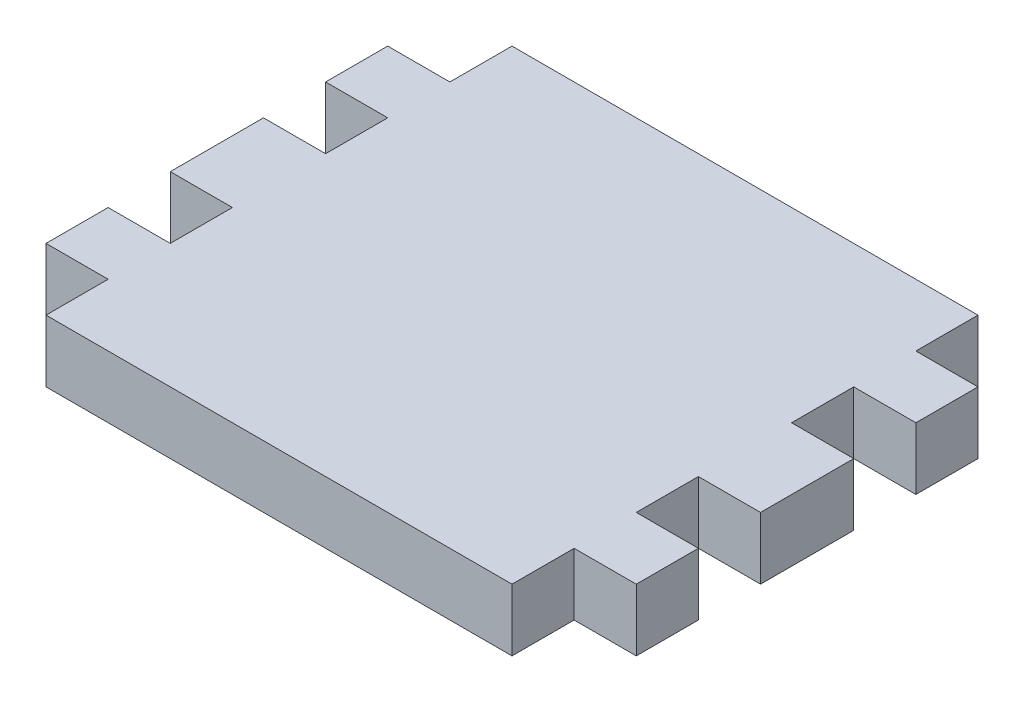
ISO-10303-21;
HEADER;
FILE_DESCRIPTION(('STEP AP214'),'2;1');
FILE_NAME('part.step','',(''),(''),'','','');
FILE_SCHEMA(('AUTOMOTIVE_DESIGN { 1 0 10303 214 1 1 1 1 }'));
ENDSEC;
DATA;
#1=APPLICATION_CONTEXT('core data for automotive mechanical design processes');
#2=APPLICATION_PROTOCOL_DEFINITION('international standard','automotive_design',2000,#1);
#3=PRODUCT_CONTEXT('',#1,'mechanical');
#4=PRODUCT('Part','Part','',(#3));
#5=PRODUCT_RELATED_PRODUCT_CATEGORY('part','',(#4));
#6=PRODUCT_DEFINITION_FORMATION('','',#4);
#7=PRODUCT_DEFINITION_CONTEXT('part definition',#1,'design');
#8=PRODUCT_DEFINITION('design','',#6,#7);
#9=PRODUCT_DEFINITION_SHAPE('','',#8);
#10=(LENGTH_UNIT() NAMED_UNIT(*) SI_UNIT(.MILLI.,.METRE.));
#11=(NAMED_UNIT(*) PLANE_ANGLE_UNIT() SI_UNIT($,.RADIAN.));
#12=(NAMED_UNIT(*) SI_UNIT($,.STERADIAN.) SOLID_ANGLE_UNIT());
#13=UNCERTAINTY_MEASURE_WITH_UNIT(LENGTH_MEASURE(1.E-05),#10,'distance_accuracy_value','');
#14=(GEOMETRIC_REPRESENTATION_CONTEXT(3) GLOBAL_UNCERTAINTY_ASSIGNED_CONTEXT((#13)) GLOBAL_UNIT_ASSIGNED_CONTEXT((#10,
#11,#12)) REPRESENTATION_CONTEXT('',''));
#15=CARTESIAN_POINT('',(0.,0.,0.));
#16=DIRECTION('',(0.,0.,1.));
#17=DIRECTION('',(1.,0.,0.));
#18=AXIS2_PLACEMENT_3D('',#15,#16,#17);
#19=CARTESIAN_POINT('',(-17.8025777777778,5.08,-11.0461777777778));
#20=DIRECTION('',(1.,0.,0.));
#21=DIRECTION('',(0.,0.,-1.));
#22=AXIS2_PLACEMENT_3D('',#19,#20,#21);
#23=PLANE('',#22);
#24=DIRECTION('',(0.,0.,1.));
#25=VECTOR('',#24,1.);
#26=CARTESIAN_POINT('',(-17.8025777777778,0.,-11.0461777777778));
#27=LINE('',#26,#25);
#28=CARTESIAN_POINT('',(-17.8025777777778,0.,4.19382222222222));
#29=VERTEX_POINT('',#28);
#30=CARTESIAN_POINT('',(-17.8025777777778,0.,11.8138222222222));
#31=VERTEX_POINT('',#30);
#32=EDGE_CURVE('E247',#29,#31,#27,.T.);
#33=ORIENTED_EDGE('',*,*,#32,.T.);
#34=DIRECTION('',(0.,1.,0.));
#35=VECTOR('',#34,1.);
#36=CARTESIAN_POINT('',(-17.8025777777778,0.,11.8138222222222));
#37=LINE('',#36,#35);
#38=CARTESIAN_POINT('',(-17.8025777777778,5.08,11.8138222222222));
#39=VERTEX_POINT('',#38);
#40=EDGE_CURVE('E404',#31,#39,#37,.T.);
#41=ORIENTED_EDGE('',*,*,#40,.T.);
#42=DIRECTION('',(0.,0.,1.));
#43=VECTOR('',#42,1.);
#44=CARTESIAN_POINT('',(-17.8025777777778,5.08,-11.0461777777778));
#45=LINE('',#44,#43);
#46=CARTESIAN_POINT('',(-17.8025777777778,5.08,4.19382222222222));
#47=VERTEX_POINT('',#46);
#48=EDGE_CURVE('E285',#47,#39,#45,.T.);
#49=ORIENTED_EDGE('',*,*,#48,.F.);
#50=DIRECTION('',(0.,1.,0.));
#51=VECTOR('',#50,1.);
#52=CARTESIAN_POINT('',(-17.8025777777778,0.,4.19382222222222));
#53=LINE('',#52,#51);
#54=EDGE_CURVE('E399',#29,#47,#53,.T.);
#55=ORIENTED_EDGE('',*,*,#54,.F.);
#56=EDGE_LOOP('',(#33,#41,#49,#55));
#57=FACE_BOUND('',#56,.T.);
#58=ADVANCED_FACE('F33',(#57),#23,.F.);
#59=CARTESIAN_POINT('',(-17.8025777777778,0.,-5.96617777777778));
#60=VERTEX_POINT('',#59);
#61=CARTESIAN_POINT('',(-17.8025777777778,0.,-0.886177777777776));
#62=VERTEX_POINT('',#61);
#63=EDGE_CURVE('E250',#60,#62,#27,.T.);
#64=ORIENTED_EDGE('',*,*,#63,.T.);
#65=DIRECTION('',(0.,1.,0.));
#66=VECTOR('',#65,1.);
#67=CARTESIAN_POINT('',(-17.8025777777778,0.,-0.886177777777776));
#68=LINE('',#67,#66);
#69=CARTESIAN_POINT('',(-17.8025777777778,5.08,-0.886177777777776));
#70=VERTEX_POINT('',#69);
#71=EDGE_CURVE('E381',#62,#70,#68,.T.);
#72=ORIENTED_EDGE('',*,*,#71,.T.);
#73=CARTESIAN_POINT('',(-17.8025777777778,5.08,-5.96617777777778));
#74=VERTEX_POINT('',#73);
#75=EDGE_CURVE('E287',#74,#70,#45,.T.);
#76=ORIENTED_EDGE('',*,*,#75,.F.);
#77=DIRECTION('',(0.,1.,0.));
#78=VECTOR('',#77,1.);
#79=CARTESIAN_POINT('',(-17.8025777777778,0.,-5.96617777777778));
#80=LINE('',#79,#78);
#81=EDGE_CURVE('E252',#60,#74,#80,.T.);
#82=ORIENTED_EDGE('',*,*,#81,.F.);
#83=EDGE_LOOP('',(#64,#72,#76,#82));
#84=FACE_BOUND('',#83,.T.);
#85=ADVANCED_FACE('F448',(#84),#23,.F.);
#86=CARTESIAN_POINT('',(30.4574222222222,5.08,-11.0461777777778));
#87=DIRECTION('',(-1.,0.,0.));
#88=DIRECTION('',(0.,0.,1.));
#89=AXIS2_PLACEMENT_3D('',#86,#87,#88);
#90=PLANE('',#89);
#91=DIRECTION('',(0.,0.,-1.));
#92=VECTOR('',#91,1.);
#93=CARTESIAN_POINT('',(30.4574222222222,0.,-11.0461777777778));
#94=LINE('',#93,#92);
#95=CARTESIAN_POINT('',(30.4574222222222,0.,-0.886177777777769));
#96=VERTEX_POINT('',#95);
#97=CARTESIAN_POINT('',(30.4574222222222,0.,-5.96617777777777));
#98=VERTEX_POINT('',#97);
#99=EDGE_CURVE('E262',#96,#98,#94,.T.);
#100=ORIENTED_EDGE('',*,*,#99,.T.);
#101=DIRECTION('',(0.,1.,0.));
#102=VECTOR('',#101,1.);
#103=CARTESIAN_POINT('',(30.4574222222222,0.,-5.96617777777777));
#104=LINE('',#103,#102);
#105=CARTESIAN_POINT('',(30.4574222222222,5.08,-5.96617777777777));
#106=VERTEX_POINT('',#105);
#107=EDGE_CURVE('E348',#98,#106,#104,.T.);
#108=ORIENTED_EDGE('',*,*,#107,.T.);
#109=DIRECTION('',(0.,0.,-1.));
#110=VECTOR('',#109,1.);
#111=CARTESIAN_POINT('',(30.4574222222222,5.08,-11.0461777777778));
#112=LINE('',#111,#110);
#113=CARTESIAN_POINT('',(30.4574222222222,5.08,-0.886177777777769));
#114=VERTEX_POINT('',#113);
#115=EDGE_CURVE('E299',#114,#106,#112,.T.);
#116=ORIENTED_EDGE('',*,*,#115,.F.);
#117=DIRECTION('',(0.,1.,0.));
#118=VECTOR('',#117,1.);
#119=CARTESIAN_POINT('',(30.4574222222222,0.,-0.886177777777769));
#120=LINE('',#119,#118);
#121=EDGE_CURVE('E352',#96,#114,#120,.T.);
#122=ORIENTED_EDGE('',*,*,#121,.F.);
#123=EDGE_LOOP('',(#100,#108,#116,#122));
#124=FACE_BOUND('',#123,.T.);
#125=ADVANCED_FACE('F506',(#124),#90,.F.);
#126=CARTESIAN_POINT('',(30.4574222222222,0.,21.9738222222222));
#127=VERTEX_POINT('',#126);
#128=CARTESIAN_POINT('',(30.4574222222222,0.,16.8938222222222));
#129=VERTEX_POINT('',#128);
#130=EDGE_CURVE('E269',#127,#129,#94,.T.);
#131=ORIENTED_EDGE('',*,*,#130,.T.);
#132=DIRECTION('',(0.,1.,0.));
#133=VECTOR('',#132,1.);
#134=CARTESIAN_POINT('',(30.4574222222222,0.,16.8938222222222));
#135=LINE('',#134,#133);
#136=CARTESIAN_POINT('',(30.4574222222222,5.08,16.8938222222222));
#137=VERTEX_POINT('',#136);
#138=EDGE_CURVE('E321',#129,#137,#135,.T.);
#139=ORIENTED_EDGE('',*,*,#138,.T.);
#140=CARTESIAN_POINT('',(30.4574222222222,5.08,21.9738222222222));
#141=VERTEX_POINT('',#140);
#142=EDGE_CURVE('E42',#141,#137,#112,.T.);
#143=ORIENTED_EDGE('',*,*,#142,.F.);
#144=DIRECTION('',(0.,1.,0.));
#145=VECTOR('',#144,1.);
#146=CARTESIAN_POINT('',(30.4574222222222,0.,21.9738222222222));
#147=LINE('',#146,#145);
#148=EDGE_CURVE('E320',#127,#141,#147,.T.);
#149=ORIENTED_EDGE('',*,*,#148,.F.);
#150=EDGE_LOOP('',(#131,#139,#143,#149));
#151=FACE_BOUND('',#150,.T.);
#152=ADVANCED_FACE('F319',(#151),#90,.F.);
#153=CARTESIAN_POINT('',(-17.8025777777778,5.08,16.8938222222222));
#154=VERTEX_POINT('',#153);
#155=CARTESIAN_POINT('',(-17.8025777777778,5.08,21.9738222222222));
#156=VERTEX_POINT('',#155);
#157=EDGE_CURVE('E238',#154,#156,#45,.T.);
#158=ORIENTED_EDGE('',*,*,#157,.F.);
#159=DIRECTION('',(0.,1.,0.));
#160=VECTOR('',#159,1.);
#161=CARTESIAN_POINT('',(-17.8025777777778,0.,16.8938222222222));
#162=LINE('',#161,#160);
#163=CARTESIAN_POINT('',(-17.8025777777778,0.,16.8938222222222));
#164=VERTEX_POINT('',#163);
#165=EDGE_CURVE('E223',#164,#154,#162,.T.);
#166=ORIENTED_EDGE('',*,*,#165,.F.);
#167=CARTESIAN_POINT('',(-17.8025777777778,0.,21.9738222222222));
#168=VERTEX_POINT('',#167);
#169=EDGE_CURVE('E236',#164,#168,#27,.T.);
#170=ORIENTED_EDGE('',*,*,#169,.T.);
#171=DIRECTION('',(0.,1.,0.));
#172=VECTOR('',#171,1.);
#173=CARTESIAN_POINT('',(-17.8025777777778,0.,21.9738222222222));
#174=LINE('',#173,#172);
#175=EDGE_CURVE('E425',#168,#156,#174,.T.);
#176=ORIENTED_EDGE('',*,*,#175,.T.);
#177=EDGE_LOOP('',(#158,#166,#170,#176));
#178=FACE_BOUND('',#177,.T.);
#179=ADVANCED_FACE('F35',(#178),#23,.F.);
#180=CARTESIAN_POINT('',(-17.8025777777778,5.08,27.0538222222222));
#181=DIRECTION('',(0.,0.,-1.));
#182=DIRECTION('',(-1.,0.,0.));
#183=AXIS2_PLACEMENT_3D('',#180,#181,#182);
#184=PLANE('',#183);
#185=DIRECTION('',(1.,0.,0.));
#186=VECTOR('',#185,1.);
#187=CARTESIAN_POINT('',(-17.8025777777778,5.08,27.0538222222222));
#188=LINE('',#187,#186);
#189=CARTESIAN_POINT('',(-12.7225777777778,5.08,27.0538222222222));
#190=VERTEX_POINT('',#189);
#191=CARTESIAN_POINT('',(25.3774222222222,5.08,27.0538222222222));
#192=VERTEX_POINT('',#191);
#193=EDGE_CURVE('E294',#190,#192,#188,.T.);
#194=ORIENTED_EDGE('',*,*,#193,.F.);
#195=DIRECTION('',(0.,1.,0.));
#196=VECTOR('',#195,1.);
#197=CARTESIAN_POINT('',(-12.7225777777778,0.,27.0538222222222));
#198=LINE('',#197,#196);
#199=CARTESIAN_POINT('',(-12.7225777777778,0.,27.0538222222222));
#200=VERTEX_POINT('',#199);
#201=EDGE_CURVE('E422',#200,#190,#198,.T.);
#202=ORIENTED_EDGE('',*,*,#201,.F.);
#203=DIRECTION('',(1.,0.,0.));
#204=VECTOR('',#203,1.);
#205=CARTESIAN_POINT('',(-17.8025777777778,0.,27.0538222222222));
#206=LINE('',#205,#204);
#207=CARTESIAN_POINT('',(25.3774222222222,0.,27.0538222222222));
#208=VERTEX_POINT('',#207);
#209=EDGE_CURVE('E256',#200,#208,#206,.T.);
#210=ORIENTED_EDGE('',*,*,#209,.T.);
#211=DIRECTION('',(0.,1.,0.));
#212=VECTOR('',#211,1.);
#213=CARTESIAN_POINT('',(25.3774222222222,0.,27.0538222222222));
#214=LINE('',#213,#212);
#215=EDGE_CURVE('E383',#208,#192,#214,.T.);
#216=ORIENTED_EDGE('',*,*,#215,.T.);
#217=EDGE_LOOP('',(#194,#202,#210,#216));
#218=FACE_BOUND('',#217,.T.);
#219=ADVANCED_FACE('F523',(#218),#184,.F.);
#220=CARTESIAN_POINT('',(30.4574222222222,0.,11.8138222222222));
#221=VERTEX_POINT('',#220);
#222=CARTESIAN_POINT('',(30.4574222222222,0.,4.19382222222223));
#223=VERTEX_POINT('',#222);
#224=EDGE_CURVE('E268',#221,#223,#94,.T.);
#225=ORIENTED_EDGE('',*,*,#224,.T.);
#226=DIRECTION('',(0.,1.,0.));
#227=VECTOR('',#226,1.);
#228=CARTESIAN_POINT('',(30.4574222222222,0.,4.19382222222223));
#229=LINE('',#228,#227);
#230=CARTESIAN_POINT('',(30.4574222222222,5.08,4.19382222222223));
#231=VERTEX_POINT('',#230);
#232=EDGE_CURVE('E354',#223,#231,#229,.T.);
#233=ORIENTED_EDGE('',*,*,#232,.T.);
#234=CARTESIAN_POINT('',(30.4574222222222,5.08,11.8138222222222));
#235=VERTEX_POINT('',#234);
#236=EDGE_CURVE('E304',#235,#231,#112,.T.);
#237=ORIENTED_EDGE('',*,*,#236,.F.);
#238=DIRECTION('',(0.,1.,0.));
#239=VECTOR('',#238,1.);
#240=CARTESIAN_POINT('',(30.4574222222222,0.,11.8138222222222));
#241=LINE('',#240,#239);
#242=EDGE_CURVE('E325',#221,#235,#241,.T.);
#243=ORIENTED_EDGE('',*,*,#242,.F.);
#244=EDGE_LOOP('',(#225,#233,#237,#243));
#245=FACE_BOUND('',#244,.T.);
#246=ADVANCED_FACE('F498',(#245),#90,.F.);
#247=CARTESIAN_POINT('',(-17.8025777777778,5.08,-11.0461777777778));
#248=DIRECTION('',(0.,0.,1.));
#249=DIRECTION('',(1.,0.,0.));
#250=AXIS2_PLACEMENT_3D('',#247,#248,#249);
#251=PLANE('',#250);
#252=DIRECTION('',(-1.,0.,0.));
#253=VECTOR('',#252,1.);
#254=CARTESIAN_POINT('',(-17.8025777777778,5.08,-11.0461777777778));
#255=LINE('',#254,#253);
#256=CARTESIAN_POINT('',(25.3774222222222,5.08,-11.0461777777778));
#257=VERTEX_POINT('',#256);
#258=CARTESIAN_POINT('',(-12.7225777777778,5.08,-11.0461777777778));
#259=VERTEX_POINT('',#258);
#260=EDGE_CURVE('E11',#257,#259,#255,.T.);
#261=ORIENTED_EDGE('',*,*,#260,.F.);
#262=DIRECTION('',(0.,1.,0.));
#263=VECTOR('',#262,1.);
#264=CARTESIAN_POINT('',(25.3774222222222,0.,-11.0461777777778));
#265=LINE('',#264,#263);
#266=CARTESIAN_POINT('',(25.3774222222222,0.,-11.0461777777778));
#267=VERTEX_POINT('',#266);
#268=EDGE_CURVE('E364',#267,#257,#265,.T.);
#269=ORIENTED_EDGE('',*,*,#268,.F.);
#270=DIRECTION('',(-1.,0.,0.));
#271=VECTOR('',#270,1.);
#272=CARTESIAN_POINT('',(-17.8025777777778,0.,-11.0461777777778));
#273=LINE('',#272,#271);
#274=CARTESIAN_POINT('',(-12.7225777777778,0.,-11.0461777777778));
#275=VERTEX_POINT('',#274);
#276=EDGE_CURVE('E37',#267,#275,#273,.T.);
#277=ORIENTED_EDGE('',*,*,#276,.T.);
#278=DIRECTION('',(0.,1.,0.));
#279=VECTOR('',#278,1.);
#280=CARTESIAN_POINT('',(-12.7225777777778,0.,-11.0461777777778));
#281=LINE('',#280,#279);
#282=EDGE_CURVE('E435',#275,#259,#281,.T.);
#283=ORIENTED_EDGE('',*,*,#282,.T.);
#284=EDGE_LOOP('',(#261,#269,#277,#283));
#285=FACE_BOUND('',#284,.T.);
#286=ADVANCED_FACE('F441',(#285),#251,.F.);
#287=CARTESIAN_POINT('',(0.,5.08,0.));
#288=DIRECTION('',(0.,1.,0.));
#289=DIRECTION('',(0.,0.,1.));
#290=AXIS2_PLACEMENT_3D('',#287,#288,#289);
#291=PLANE('',#290);
#292=DIRECTION('',(1.,0.,0.));
#293=VECTOR('',#292,1.);
#294=CARTESIAN_POINT('',(30.4574222222222,5.08,-5.96617777777777));
#295=LINE('',#294,#293);
#296=CARTESIAN_POINT('',(25.3774222222222,5.08,-5.96617777777777));
#297=VERTEX_POINT('',#296);
#298=EDGE_CURVE('E362',#297,#106,#295,.T.);
#299=ORIENTED_EDGE('',*,*,#298,.F.);
#300=DIRECTION('',(0.,0.,1.));
#301=VECTOR('',#300,1.);
#302=CARTESIAN_POINT('',(25.3774222222222,5.08,-11.0461777777778));
#303=LINE('',#302,#301);
#304=EDGE_CURVE('E365',#257,#297,#303,.T.);
#305=ORIENTED_EDGE('',*,*,#304,.F.);
#306=ORIENTED_EDGE('',*,*,#260,.T.);
#307=DIRECTION('',(0.,0.,-1.));
#308=VECTOR('',#307,1.);
#309=CARTESIAN_POINT('',(-12.7225777777778,5.08,-11.0461777777778));
#310=LINE('',#309,#308);
#311=CARTESIAN_POINT('',(-12.7225777777778,5.08,-5.96617777777778));
#312=VERTEX_POINT('',#311);
#313=EDGE_CURVE('E424',#312,#259,#310,.T.);
#314=ORIENTED_EDGE('',*,*,#313,.F.);
#315=DIRECTION('',(1.,0.,0.));
#316=VECTOR('',#315,1.);
#317=CARTESIAN_POINT('',(-17.8025777777778,5.08,-5.96617777777778));
#318=LINE('',#317,#316);
#319=EDGE_CURVE('E432',#74,#312,#318,.T.);
#320=ORIENTED_EDGE('',*,*,#319,.F.);
#321=ORIENTED_EDGE('',*,*,#75,.T.);
#322=DIRECTION('',(-1.,0.,0.));
#323=VECTOR('',#322,1.);
#324=CARTESIAN_POINT('',(-17.8025777777778,5.08,-0.886177777777776));
#325=LINE('',#324,#323);
#326=CARTESIAN_POINT('',(-12.7225777777778,5.08,-0.886177777777776));
#327=VERTEX_POINT('',#326);
#328=EDGE_CURVE('E393',#327,#70,#325,.T.);
#329=ORIENTED_EDGE('',*,*,#328,.F.);
#330=DIRECTION('',(0.,0.,-1.));
#331=VECTOR('',#330,1.);
#332=CARTESIAN_POINT('',(-12.7225777777778,5.08,-0.886177777777776));
#333=LINE('',#332,#331);
#334=CARTESIAN_POINT('',(-12.7225777777778,5.08,4.19382222222222));
#335=VERTEX_POINT('',#334);
#336=EDGE_CURVE('E403',#335,#327,#333,.T.);
#337=ORIENTED_EDGE('',*,*,#336,.F.);
#338=DIRECTION('',(1.,0.,0.));
#339=VECTOR('',#338,1.);
#340=CARTESIAN_POINT('',(-17.8025777777778,5.08,4.19382222222222));
#341=LINE('',#340,#339);
#342=EDGE_CURVE('E400',#47,#335,#341,.T.);
#343=ORIENTED_EDGE('',*,*,#342,.F.);
#344=ORIENTED_EDGE('',*,*,#48,.T.);
#345=DIRECTION('',(-1.,0.,0.));
#346=VECTOR('',#345,1.);
#347=CARTESIAN_POINT('',(-17.8025777777778,5.08,11.8138222222222));
#348=LINE('',#347,#346);
#349=CARTESIAN_POINT('',(-12.7225777777778,5.08,11.8138222222222));
#350=VERTEX_POINT('',#349);
#351=EDGE_CURVE('E230',#350,#39,#348,.T.);
#352=ORIENTED_EDGE('',*,*,#351,.F.);
#353=DIRECTION('',(0.,0.,-1.));
#354=VECTOR('',#353,1.);
#355=CARTESIAN_POINT('',(-12.7225777777778,5.08,16.8938222222222));
#356=LINE('',#355,#354);
#357=CARTESIAN_POINT('',(-12.7225777777778,5.08,16.8938222222222));
#358=VERTEX_POINT('',#357);
#359=EDGE_CURVE('E734',#358,#350,#356,.T.);
#360=ORIENTED_EDGE('',*,*,#359,.F.);
#361=DIRECTION('',(1.,0.,0.));
#362=VECTOR('',#361,1.);
#363=CARTESIAN_POINT('',(-17.8025777777778,5.08,16.8938222222222));
#364=LINE('',#363,#362);
#365=EDGE_CURVE('E487',#154,#358,#364,.T.);
#366=ORIENTED_EDGE('',*,*,#365,.F.);
#367=ORIENTED_EDGE('',*,*,#157,.T.);
#368=DIRECTION('',(-1.,0.,0.));
#369=VECTOR('',#368,1.);
#370=CARTESIAN_POINT('',(-17.8025777777778,5.08,21.9738222222222));
#371=LINE('',#370,#369);
#372=CARTESIAN_POINT('',(-12.7225777777778,5.08,21.9738222222222));
#373=VERTEX_POINT('',#372);
#374=EDGE_CURVE('E416',#373,#156,#371,.T.);
#375=ORIENTED_EDGE('',*,*,#374,.F.);
#376=DIRECTION('',(0.,0.,-1.));
#377=VECTOR('',#376,1.);
#378=CARTESIAN_POINT('',(-12.7225777777778,5.08,27.0538222222222));
#379=LINE('',#378,#377);
#380=EDGE_CURVE('E385',#190,#373,#379,.T.);
#381=ORIENTED_EDGE('',*,*,#380,.F.);
#382=ORIENTED_EDGE('',*,*,#193,.T.);
#383=DIRECTION('',(0.,0.,1.));
#384=VECTOR('',#383,1.);
#385=CARTESIAN_POINT('',(25.3774222222222,5.08,27.0538222222222));
#386=LINE('',#385,#384);
#387=CARTESIAN_POINT('',(25.3774222222222,5.08,21.9738222222222));
#388=VERTEX_POINT('',#387);
#389=EDGE_CURVE('E377',#388,#192,#386,.T.);
#390=ORIENTED_EDGE('',*,*,#389,.F.);
#391=DIRECTION('',(-1.,0.,0.));
#392=VECTOR('',#391,1.);
#393=CARTESIAN_POINT('',(30.4574222222222,5.08,21.9738222222222));
#394=LINE('',#393,#392);
#395=EDGE_CURVE('E318',#141,#388,#394,.T.);
#396=ORIENTED_EDGE('',*,*,#395,.F.);
#397=ORIENTED_EDGE('',*,*,#142,.T.);
#398=DIRECTION('',(1.,0.,0.));
#399=VECTOR('',#398,1.);
#400=CARTESIAN_POINT('',(30.4574222222222,5.08,16.8938222222222));
#401=LINE('',#400,#399);
#402=CARTESIAN_POINT('',(25.3774222222222,5.08,16.8938222222222));
#403=VERTEX_POINT('',#402);
#404=EDGE_CURVE('E316',#403,#137,#401,.T.);
#405=ORIENTED_EDGE('',*,*,#404,.F.);
#406=DIRECTION('',(0.,0.,1.));
#407=VECTOR('',#406,1.);
#408=CARTESIAN_POINT('',(25.3774222222222,5.08,16.8938222222222));
#409=LINE('',#408,#407);
#410=CARTESIAN_POINT('',(25.3774222222222,5.08,11.8138222222222));
#411=VERTEX_POINT('',#410);
#412=EDGE_CURVE('E477',#411,#403,#409,.T.);
#413=ORIENTED_EDGE('',*,*,#412,.F.);
#414=DIRECTION('',(-1.,0.,0.));
#415=VECTOR('',#414,1.);
#416=CARTESIAN_POINT('',(30.4574222222222,5.08,11.8138222222222));
#417=LINE('',#416,#415);
#418=EDGE_CURVE('E481',#235,#411,#417,.T.);
#419=ORIENTED_EDGE('',*,*,#418,.F.);
#420=ORIENTED_EDGE('',*,*,#236,.T.);
#421=DIRECTION('',(1.,0.,0.));
#422=VECTOR('',#421,1.);
#423=CARTESIAN_POINT('',(30.4574222222222,5.08,4.19382222222223));
#424=LINE('',#423,#422);
#425=CARTESIAN_POINT('',(25.3774222222222,5.08,4.19382222222223));
#426=VERTEX_POINT('',#425);
#427=EDGE_CURVE('E339',#426,#231,#424,.T.);
#428=ORIENTED_EDGE('',*,*,#427,.F.);
#429=DIRECTION('',(0.,0.,1.));
#430=VECTOR('',#429,1.);
#431=CARTESIAN_POINT('',(25.3774222222222,5.08,-0.886177777777772));
#432=LINE('',#431,#430);
#433=CARTESIAN_POINT('',(25.3774222222222,5.08,-0.886177777777772));
#434=VERTEX_POINT('',#433);
#435=EDGE_CURVE('E347',#434,#426,#432,.T.);
#436=ORIENTED_EDGE('',*,*,#435,.F.);
#437=DIRECTION('',(-1.,0.,0.));
#438=VECTOR('',#437,1.);
#439=CARTESIAN_POINT('',(30.4574222222222,5.08,-0.886177777777769));
#440=LINE('',#439,#438);
#441=EDGE_CURVE('E344',#114,#434,#440,.T.);
#442=ORIENTED_EDGE('',*,*,#441,.F.);
#443=ORIENTED_EDGE('',*,*,#115,.T.);
#444=EDGE_LOOP('',(#299,#305,#306,#314,#320,#321,#329,#337,#343,#344,#352,#360,#366,#367,#375,
#381,#382,#390,#396,#397,#405,#413,#419,#420,#428,#436,#442,#443));
#445=FACE_BOUND('',#444,.T.);
#446=ADVANCED_FACE('F314',(#445),#291,.T.);
#447=CARTESIAN_POINT('',(0.,0.,0.));
#448=DIRECTION('',(0.,1.,0.));
#449=DIRECTION('',(0.,0.,1.));
#450=AXIS2_PLACEMENT_3D('',#447,#448,#449);
#451=PLANE('',#450);
#452=DIRECTION('',(0.,0.,1.));
#453=VECTOR('',#452,1.);
#454=CARTESIAN_POINT('',(25.3774222222222,0.,-11.0461777777778));
#455=LINE('',#454,#453);
#456=CARTESIAN_POINT('',(25.3774222222222,0.,-5.96617777777777));
#457=VERTEX_POINT('',#456);
#458=EDGE_CURVE('E360',#267,#457,#455,.T.);
#459=ORIENTED_EDGE('',*,*,#458,.T.);
#460=DIRECTION('',(1.,0.,0.));
#461=VECTOR('',#460,1.);
#462=CARTESIAN_POINT('',(30.4574222222222,0.,-5.96617777777777));
#463=LINE('',#462,#461);
#464=EDGE_CURVE('E50',#457,#98,#463,.T.);
#465=ORIENTED_EDGE('',*,*,#464,.T.);
#466=ORIENTED_EDGE('',*,*,#99,.F.);
#467=DIRECTION('',(-1.,0.,0.));
#468=VECTOR('',#467,1.);
#469=CARTESIAN_POINT('',(30.4574222222222,0.,-0.886177777777769));
#470=LINE('',#469,#468);
#471=CARTESIAN_POINT('',(25.3774222222222,0.,-0.886177777777772));
#472=VERTEX_POINT('',#471);
#473=EDGE_CURVE('E335',#96,#472,#470,.T.);
#474=ORIENTED_EDGE('',*,*,#473,.T.);
#475=DIRECTION('',(0.,0.,1.));
#476=VECTOR('',#475,1.);
#477=CARTESIAN_POINT('',(25.3774222222222,0.,-0.886177777777772));
#478=LINE('',#477,#476);
#479=CARTESIAN_POINT('',(25.3774222222222,0.,4.19382222222223));
#480=VERTEX_POINT('',#479);
#481=EDGE_CURVE('E338',#472,#480,#478,.T.);
#482=ORIENTED_EDGE('',*,*,#481,.T.);
#483=DIRECTION('',(1.,0.,0.));
#484=VECTOR('',#483,1.);
#485=CARTESIAN_POINT('',(30.4574222222222,0.,4.19382222222223));
#486=LINE('',#485,#484);
#487=EDGE_CURVE('E58',#480,#223,#486,.T.);
#488=ORIENTED_EDGE('',*,*,#487,.T.);
#489=ORIENTED_EDGE('',*,*,#224,.F.);
#490=DIRECTION('',(-1.,0.,0.));
#491=VECTOR('',#490,1.);
#492=CARTESIAN_POINT('',(30.4574222222222,0.,11.8138222222222));
#493=LINE('',#492,#491);
#494=CARTESIAN_POINT('',(25.3774222222222,0.,11.8138222222222));
#495=VERTEX_POINT('',#494);
#496=EDGE_CURVE('E331',#221,#495,#493,.T.);
#497=ORIENTED_EDGE('',*,*,#496,.T.);
#498=DIRECTION('',(0.,0.,1.));
#499=VECTOR('',#498,1.);
#500=CARTESIAN_POINT('',(25.3774222222222,0.,16.8938222222222));
#501=LINE('',#500,#499);
#502=CARTESIAN_POINT('',(25.3774222222222,0.,16.8938222222222));
#503=VERTEX_POINT('',#502);
#504=EDGE_CURVE('E326',#495,#503,#501,.T.);
#505=ORIENTED_EDGE('',*,*,#504,.T.);
#506=DIRECTION('',(1.,0.,0.));
#507=VECTOR('',#506,1.);
#508=CARTESIAN_POINT('',(30.4574222222222,0.,16.8938222222222));
#509=LINE('',#508,#507);
#510=EDGE_CURVE('E475',#503,#129,#509,.T.);
#511=ORIENTED_EDGE('',*,*,#510,.T.);
#512=ORIENTED_EDGE('',*,*,#130,.F.);
#513=DIRECTION('',(-1.,0.,0.));
#514=VECTOR('',#513,1.);
#515=CARTESIAN_POINT('',(30.4574222222222,0.,21.9738222222222));
#516=LINE('',#515,#514);
#517=CARTESIAN_POINT('',(25.3774222222222,0.,21.9738222222222));
#518=VERTEX_POINT('',#517);
#519=EDGE_CURVE('E373',#127,#518,#516,.T.);
#520=ORIENTED_EDGE('',*,*,#519,.T.);
#521=DIRECTION('',(0.,0.,1.));
#522=VECTOR('',#521,1.);
#523=CARTESIAN_POINT('',(25.3774222222222,0.,27.0538222222222));
#524=LINE('',#523,#522);
#525=EDGE_CURVE('E376',#518,#208,#524,.T.);
#526=ORIENTED_EDGE('',*,*,#525,.T.);
#527=ORIENTED_EDGE('',*,*,#209,.F.);
#528=DIRECTION('',(0.,0.,-1.));
#529=VECTOR('',#528,1.);
#530=CARTESIAN_POINT('',(-12.7225777777778,0.,27.0538222222222));
#531=LINE('',#530,#529);
#532=CARTESIAN_POINT('',(-12.7225777777778,0.,21.9738222222222));
#533=VERTEX_POINT('',#532);
#534=EDGE_CURVE('E414',#200,#533,#531,.T.);
#535=ORIENTED_EDGE('',*,*,#534,.T.);
#536=DIRECTION('',(-1.,0.,0.));
#537=VECTOR('',#536,1.);
#538=CARTESIAN_POINT('',(-17.8025777777778,0.,21.9738222222222));
#539=LINE('',#538,#537);
#540=EDGE_CURVE('E246',#533,#168,#539,.T.);
#541=ORIENTED_EDGE('',*,*,#540,.T.);
#542=ORIENTED_EDGE('',*,*,#169,.F.);
#543=DIRECTION('',(1.,0.,0.));
#544=VECTOR('',#543,1.);
#545=CARTESIAN_POINT('',(-17.8025777777778,0.,16.8938222222222));
#546=LINE('',#545,#544);
#547=CARTESIAN_POINT('',(-12.7225777777778,0.,16.8938222222222));
#548=VERTEX_POINT('',#547);
#549=EDGE_CURVE('E219',#164,#548,#546,.T.);
#550=ORIENTED_EDGE('',*,*,#549,.T.);
#551=DIRECTION('',(0.,0.,-1.));
#552=VECTOR('',#551,1.);
#553=CARTESIAN_POINT('',(-12.7225777777778,0.,16.8938222222222));
#554=LINE('',#553,#552);
#555=CARTESIAN_POINT('',(-12.7225777777778,0.,11.8138222222222));
#556=VERTEX_POINT('',#555);
#557=EDGE_CURVE('E229',#548,#556,#554,.T.);
#558=ORIENTED_EDGE('',*,*,#557,.T.);
#559=DIRECTION('',(-1.,0.,0.));
#560=VECTOR('',#559,1.);
#561=CARTESIAN_POINT('',(-17.8025777777778,0.,11.8138222222222));
#562=LINE('',#561,#560);
#563=EDGE_CURVE('E239',#556,#31,#562,.T.);
#564=ORIENTED_EDGE('',*,*,#563,.T.);
#565=ORIENTED_EDGE('',*,*,#32,.F.);
#566=DIRECTION('',(1.,0.,0.));
#567=VECTOR('',#566,1.);
#568=CARTESIAN_POINT('',(-17.8025777777778,0.,4.19382222222222));
#569=LINE('',#568,#567);
#570=CARTESIAN_POINT('',(-12.7225777777778,0.,4.19382222222222));
#571=VERTEX_POINT('',#570);
#572=EDGE_CURVE('E389',#29,#571,#569,.T.);
#573=ORIENTED_EDGE('',*,*,#572,.T.);
#574=DIRECTION('',(0.,0.,-1.));
#575=VECTOR('',#574,1.);
#576=CARTESIAN_POINT('',(-12.7225777777778,0.,-0.886177777777776));
#577=LINE('',#576,#575);
#578=CARTESIAN_POINT('',(-12.7225777777778,0.,-0.886177777777776));
#579=VERTEX_POINT('',#578);
#580=EDGE_CURVE('E392',#571,#579,#577,.T.);
#581=ORIENTED_EDGE('',*,*,#580,.T.);
#582=DIRECTION('',(-1.,0.,0.));
#583=VECTOR('',#582,1.);
#584=CARTESIAN_POINT('',(-17.8025777777778,0.,-0.886177777777776));
#585=LINE('',#584,#583);
#586=EDGE_CURVE('E396',#579,#62,#585,.T.);
#587=ORIENTED_EDGE('',*,*,#586,.T.);
#588=ORIENTED_EDGE('',*,*,#63,.F.);
#589=DIRECTION('',(1.,0.,0.));
#590=VECTOR('',#589,1.);
#591=CARTESIAN_POINT('',(-17.8025777777778,0.,-5.96617777777778));
#592=LINE('',#591,#590);
#593=CARTESIAN_POINT('',(-12.7225777777778,0.,-5.96617777777778));
#594=VERTEX_POINT('',#593);
#595=EDGE_CURVE('E431',#60,#594,#592,.T.);
#596=ORIENTED_EDGE('',*,*,#595,.T.);
#597=DIRECTION('',(0.,0.,-1.));
#598=VECTOR('',#597,1.);
#599=CARTESIAN_POINT('',(-12.7225777777778,0.,-11.0461777777778));
#600=LINE('',#599,#598);
#601=EDGE_CURVE('E428',#594,#275,#600,.T.);
#602=ORIENTED_EDGE('',*,*,#601,.T.);
#603=ORIENTED_EDGE('',*,*,#276,.F.);
#604=EDGE_LOOP('',(#459,#465,#466,#474,#482,#488,#489,#497,#505,#511,#512,#520,#526,#527,#535,
#541,#542,#550,#558,#564,#565,#573,#581,#587,#588,#596,#602,#603));
#605=FACE_BOUND('',#604,.T.);
#606=ADVANCED_FACE('F243',(#605),#451,.F.);
#607=CARTESIAN_POINT('',(-12.7225777777778,0.,-11.0461777777778));
#608=DIRECTION('',(1.,0.,0.));
#609=DIRECTION('',(0.,0.,-1.));
#610=AXIS2_PLACEMENT_3D('',#607,#608,#609);
#611=PLANE('',#610);
#612=ORIENTED_EDGE('',*,*,#313,.T.);
#613=ORIENTED_EDGE('',*,*,#282,.F.);
#614=ORIENTED_EDGE('',*,*,#601,.F.);
#615=DIRECTION('',(0.,1.,0.));
#616=VECTOR('',#615,1.);
#617=CARTESIAN_POINT('',(-12.7225777777778,0.,-5.96617777777778));
#618=LINE('',#617,#616);
#619=EDGE_CURVE('E248',#594,#312,#618,.T.);
#620=ORIENTED_EDGE('',*,*,#619,.T.);
#621=EDGE_LOOP('',(#612,#613,#614,#620));
#622=FACE_BOUND('',#621,.T.);
#623=ADVANCED_FACE('F443',(#622),#611,.F.);
#624=CARTESIAN_POINT('',(-17.8025777777778,0.,-5.96617777777778));
#625=DIRECTION('',(0.,0.,1.));
#626=DIRECTION('',(1.,0.,0.));
#627=AXIS2_PLACEMENT_3D('',#624,#625,#626);
#628=PLANE('',#627);
#629=ORIENTED_EDGE('',*,*,#319,.T.);
#630=ORIENTED_EDGE('',*,*,#619,.F.);
#631=ORIENTED_EDGE('',*,*,#595,.F.);
#632=ORIENTED_EDGE('',*,*,#81,.T.);
#633=EDGE_LOOP('',(#629,#630,#631,#632));
#634=FACE_BOUND('',#633,.T.);
#635=ADVANCED_FACE('F447',(#634),#628,.F.);
#636=CARTESIAN_POINT('',(-17.8025777777778,0.,-0.886177777777776));
#637=DIRECTION('',(0.,0.,-1.));
#638=DIRECTION('',(-1.,0.,0.));
#639=AXIS2_PLACEMENT_3D('',#636,#637,#638);
#640=PLANE('',#639);
#641=ORIENTED_EDGE('',*,*,#328,.T.);
#642=ORIENTED_EDGE('',*,*,#71,.F.);
#643=ORIENTED_EDGE('',*,*,#586,.F.);
#644=DIRECTION('',(0.,1.,0.));
#645=VECTOR('',#644,1.);
#646=CARTESIAN_POINT('',(-12.7225777777778,0.,-0.886177777777776));
#647=LINE('',#646,#645);
#648=EDGE_CURVE('E409',#579,#327,#647,.T.);
#649=ORIENTED_EDGE('',*,*,#648,.T.);
#650=EDGE_LOOP('',(#641,#642,#643,#649));
#651=FACE_BOUND('',#650,.T.);
#652=ADVANCED_FACE('F451',(#651),#640,.F.);
#653=CARTESIAN_POINT('',(-12.7225777777778,0.,-0.886177777777776));
#654=DIRECTION('',(1.,0.,0.));
#655=DIRECTION('',(0.,0.,-1.));
#656=AXIS2_PLACEMENT_3D('',#653,#654,#655);
#657=PLANE('',#656);
#658=ORIENTED_EDGE('',*,*,#336,.T.);
#659=ORIENTED_EDGE('',*,*,#648,.F.);
#660=ORIENTED_EDGE('',*,*,#580,.F.);
#661=DIRECTION('',(0.,1.,0.));
#662=VECTOR('',#661,1.);
#663=CARTESIAN_POINT('',(-12.7225777777778,0.,4.19382222222222));
#664=LINE('',#663,#662);
#665=EDGE_CURVE('E411',#571,#335,#664,.T.);
#666=ORIENTED_EDGE('',*,*,#665,.T.);
#667=EDGE_LOOP('',(#658,#659,#660,#666));
#668=FACE_BOUND('',#667,.T.);
#669=ADVANCED_FACE('F455',(#668),#657,.F.);
#670=CARTESIAN_POINT('',(-17.8025777777778,0.,4.19382222222222));
#671=DIRECTION('',(0.,0.,1.));
#672=DIRECTION('',(1.,0.,0.));
#673=AXIS2_PLACEMENT_3D('',#670,#671,#672);
#674=PLANE('',#673);
#675=ORIENTED_EDGE('',*,*,#342,.T.);
#676=ORIENTED_EDGE('',*,*,#665,.F.);
#677=ORIENTED_EDGE('',*,*,#572,.F.);
#678=ORIENTED_EDGE('',*,*,#54,.T.);
#679=EDGE_LOOP('',(#675,#676,#677,#678));
#680=FACE_BOUND('',#679,.T.);
#681=ADVANCED_FACE('F457',(#680),#674,.F.);
#682=CARTESIAN_POINT('',(25.3774222222222,0.,27.0538222222222));
#683=DIRECTION('',(-1.,0.,0.));
#684=DIRECTION('',(0.,0.,1.));
#685=AXIS2_PLACEMENT_3D('',#682,#683,#684);
#686=PLANE('',#685);
#687=ORIENTED_EDGE('',*,*,#389,.T.);
#688=ORIENTED_EDGE('',*,*,#215,.F.);
#689=ORIENTED_EDGE('',*,*,#525,.F.);
#690=DIRECTION('',(0.,1.,0.));
#691=VECTOR('',#690,1.);
#692=CARTESIAN_POINT('',(25.3774222222222,0.,21.9738222222222));
#693=LINE('',#692,#691);
#694=EDGE_CURVE('E386',#518,#388,#693,.T.);
#695=ORIENTED_EDGE('',*,*,#694,.T.);
#696=EDGE_LOOP('',(#687,#688,#689,#695));
#697=FACE_BOUND('',#696,.T.);
#698=ADVANCED_FACE('F560',(#697),#686,.F.);
#699=CARTESIAN_POINT('',(30.4574222222222,0.,21.9738222222222));
#700=DIRECTION('',(0.,0.,-1.));
#701=DIRECTION('',(-1.,0.,0.));
#702=AXIS2_PLACEMENT_3D('',#699,#700,#701);
#703=PLANE('',#702);
#704=ORIENTED_EDGE('',*,*,#395,.T.);
#705=ORIENTED_EDGE('',*,*,#694,.F.);
#706=ORIENTED_EDGE('',*,*,#519,.F.);
#707=ORIENTED_EDGE('',*,*,#148,.T.);
#708=EDGE_LOOP('',(#704,#705,#706,#707));
#709=FACE_BOUND('',#708,.T.);
#710=ADVANCED_FACE('F552',(#709),#703,.F.);
#711=CARTESIAN_POINT('',(-12.7225777777778,0.,27.0538222222222));
#712=DIRECTION('',(1.,0.,0.));
#713=DIRECTION('',(0.,0.,-1.));
#714=AXIS2_PLACEMENT_3D('',#711,#712,#713);
#715=PLANE('',#714);
#716=ORIENTED_EDGE('',*,*,#380,.T.);
#717=DIRECTION('',(0.,1.,0.));
#718=VECTOR('',#717,1.);
#719=CARTESIAN_POINT('',(-12.7225777777778,0.,21.9738222222222));
#720=LINE('',#719,#718);
#721=EDGE_CURVE('E418',#533,#373,#720,.T.);
#722=ORIENTED_EDGE('',*,*,#721,.F.);
#723=ORIENTED_EDGE('',*,*,#534,.F.);
#724=ORIENTED_EDGE('',*,*,#201,.T.);
#725=EDGE_LOOP('',(#716,#722,#723,#724));
#726=FACE_BOUND('',#725,.T.);
#727=ADVANCED_FACE('F548',(#726),#715,.F.);
#728=CARTESIAN_POINT('',(-17.8025777777778,0.,21.9738222222222));
#729=DIRECTION('',(0.,0.,-1.));
#730=DIRECTION('',(-1.,0.,0.));
#731=AXIS2_PLACEMENT_3D('',#728,#729,#730);
#732=PLANE('',#731);
#733=ORIENTED_EDGE('',*,*,#374,.T.);
#734=ORIENTED_EDGE('',*,*,#175,.F.);
#735=ORIENTED_EDGE('',*,*,#540,.F.);
#736=ORIENTED_EDGE('',*,*,#721,.T.);
#737=EDGE_LOOP('',(#733,#734,#735,#736));
#738=FACE_BOUND('',#737,.T.);
#739=ADVANCED_FACE('F551',(#738),#732,.F.);
#740=CARTESIAN_POINT('',(-17.8025777777778,0.,11.8138222222222));
#741=DIRECTION('',(0.,0.,-1.));
#742=DIRECTION('',(-1.,0.,0.));
#743=AXIS2_PLACEMENT_3D('',#740,#741,#742);
#744=PLANE('',#743);
#745=ORIENTED_EDGE('',*,*,#351,.T.);
#746=ORIENTED_EDGE('',*,*,#40,.F.);
#747=ORIENTED_EDGE('',*,*,#563,.F.);
#748=DIRECTION('',(0.,1.,0.));
#749=VECTOR('',#748,1.);
#750=CARTESIAN_POINT('',(-12.7225777777778,0.,11.8138222222222));
#751=LINE('',#750,#749);
#752=EDGE_CURVE('E468',#556,#350,#751,.T.);
#753=ORIENTED_EDGE('',*,*,#752,.T.);
#754=EDGE_LOOP('',(#745,#746,#747,#753));
#755=FACE_BOUND('',#754,.T.);
#756=ADVANCED_FACE('F556',(#755),#744,.F.);
#757=CARTESIAN_POINT('',(-12.7225777777778,0.,16.8938222222222));
#758=DIRECTION('',(1.,0.,0.));
#759=DIRECTION('',(0.,0.,-1.));
#760=AXIS2_PLACEMENT_3D('',#757,#758,#759);
#761=PLANE('',#760);
#762=ORIENTED_EDGE('',*,*,#359,.T.);
#763=ORIENTED_EDGE('',*,*,#752,.F.);
#764=ORIENTED_EDGE('',*,*,#557,.F.);
#765=DIRECTION('',(0.,1.,0.));
#766=VECTOR('',#765,1.);
#767=CARTESIAN_POINT('',(-12.7225777777778,0.,16.8938222222222));
#768=LINE('',#767,#766);
#769=EDGE_CURVE('E225',#548,#358,#768,.T.);
#770=ORIENTED_EDGE('',*,*,#769,.T.);
#771=EDGE_LOOP('',(#762,#763,#764,#770));
#772=FACE_BOUND('',#771,.T.);
#773=ADVANCED_FACE('F580',(#772),#761,.F.);
#774=CARTESIAN_POINT('',(-17.8025777777778,0.,16.8938222222222));
#775=DIRECTION('',(0.,0.,1.));
#776=DIRECTION('',(1.,0.,0.));
#777=AXIS2_PLACEMENT_3D('',#774,#775,#776);
#778=PLANE('',#777);
#779=ORIENTED_EDGE('',*,*,#365,.T.);
#780=ORIENTED_EDGE('',*,*,#769,.F.);
#781=ORIENTED_EDGE('',*,*,#549,.F.);
#782=ORIENTED_EDGE('',*,*,#165,.T.);
#783=EDGE_LOOP('',(#779,#780,#781,#782));
#784=FACE_BOUND('',#783,.T.);
#785=ADVANCED_FACE('F222',(#784),#778,.F.);
#786=CARTESIAN_POINT('',(30.4574222222222,0.,16.8938222222222));
#787=DIRECTION('',(0.,0.,1.));
#788=DIRECTION('',(1.,0.,0.));
#789=AXIS2_PLACEMENT_3D('',#786,#787,#788);
#790=PLANE('',#789);
#791=ORIENTED_EDGE('',*,*,#404,.T.);
#792=ORIENTED_EDGE('',*,*,#138,.F.);
#793=ORIENTED_EDGE('',*,*,#510,.F.);
#794=DIRECTION('',(0.,1.,0.));
#795=VECTOR('',#794,1.);
#796=CARTESIAN_POINT('',(25.3774222222222,0.,16.8938222222222));
#797=LINE('',#796,#795);
#798=EDGE_CURVE('E486',#503,#403,#797,.T.);
#799=ORIENTED_EDGE('',*,*,#798,.T.);
#800=EDGE_LOOP('',(#791,#792,#793,#799));
#801=FACE_BOUND('',#800,.T.);
#802=ADVANCED_FACE('F572',(#801),#790,.F.);
#803=CARTESIAN_POINT('',(25.3774222222222,0.,16.8938222222222));
#804=DIRECTION('',(-1.,0.,0.));
#805=DIRECTION('',(0.,0.,1.));
#806=AXIS2_PLACEMENT_3D('',#803,#804,#805);
#807=PLANE('',#806);
#808=ORIENTED_EDGE('',*,*,#412,.T.);
#809=ORIENTED_EDGE('',*,*,#798,.F.);
#810=ORIENTED_EDGE('',*,*,#504,.F.);
#811=DIRECTION('',(0.,1.,0.));
#812=VECTOR('',#811,1.);
#813=CARTESIAN_POINT('',(25.3774222222222,0.,11.8138222222222));
#814=LINE('',#813,#812);
#815=EDGE_CURVE('E328',#495,#411,#814,.T.);
#816=ORIENTED_EDGE('',*,*,#815,.T.);
#817=EDGE_LOOP('',(#808,#809,#810,#816));
#818=FACE_BOUND('',#817,.T.);
#819=ADVANCED_FACE('F490',(#818),#807,.F.);
#820=CARTESIAN_POINT('',(30.4574222222222,0.,11.8138222222222));
#821=DIRECTION('',(0.,0.,-1.));
#822=DIRECTION('',(-1.,0.,0.));
#823=AXIS2_PLACEMENT_3D('',#820,#821,#822);
#824=PLANE('',#823);
#825=ORIENTED_EDGE('',*,*,#418,.T.);
#826=ORIENTED_EDGE('',*,*,#815,.F.);
#827=ORIENTED_EDGE('',*,*,#496,.F.);
#828=ORIENTED_EDGE('',*,*,#242,.T.);
#829=EDGE_LOOP('',(#825,#826,#827,#828));
#830=FACE_BOUND('',#829,.T.);
#831=ADVANCED_FACE('F493',(#830),#824,.F.);
#832=CARTESIAN_POINT('',(30.4574222222222,0.,-0.886177777777769));
#833=DIRECTION('',(0.,0.,-1.));
#834=DIRECTION('',(-1.,0.,0.));
#835=AXIS2_PLACEMENT_3D('',#832,#833,#834);
#836=PLANE('',#835);
#837=ORIENTED_EDGE('',*,*,#441,.T.);
#838=DIRECTION('',(0.,1.,0.));
#839=VECTOR('',#838,1.);
#840=CARTESIAN_POINT('',(25.3774222222222,0.,-0.886177777777772));
#841=LINE('',#840,#839);
#842=EDGE_CURVE('E343',#472,#434,#841,.T.);
#843=ORIENTED_EDGE('',*,*,#842,.F.);
#844=ORIENTED_EDGE('',*,*,#473,.F.);
#845=ORIENTED_EDGE('',*,*,#121,.T.);
#846=EDGE_LOOP('',(#837,#843,#844,#845));
#847=FACE_BOUND('',#846,.T.);
#848=ADVANCED_FACE('F586',(#847),#836,.F.);
#849=CARTESIAN_POINT('',(30.4574222222222,0.,4.19382222222223));
#850=DIRECTION('',(0.,0.,1.));
#851=DIRECTION('',(1.,0.,0.));
#852=AXIS2_PLACEMENT_3D('',#849,#850,#851);
#853=PLANE('',#852);
#854=ORIENTED_EDGE('',*,*,#427,.T.);
#855=ORIENTED_EDGE('',*,*,#232,.F.);
#856=ORIENTED_EDGE('',*,*,#487,.F.);
#857=DIRECTION('',(0.,1.,0.));
#858=VECTOR('',#857,1.);
#859=CARTESIAN_POINT('',(25.3774222222222,0.,4.19382222222223));
#860=LINE('',#859,#858);
#861=EDGE_CURVE('E357',#480,#426,#860,.T.);
#862=ORIENTED_EDGE('',*,*,#861,.T.);
#863=EDGE_LOOP('',(#854,#855,#856,#862));
#864=FACE_BOUND('',#863,.T.);
#865=ADVANCED_FACE('F500',(#864),#853,.F.);
#866=CARTESIAN_POINT('',(25.3774222222222,0.,-0.886177777777772));
#867=DIRECTION('',(-1.,0.,0.));
#868=DIRECTION('',(0.,0.,1.));
#869=AXIS2_PLACEMENT_3D('',#866,#867,#868);
#870=PLANE('',#869);
#871=ORIENTED_EDGE('',*,*,#435,.T.);
#872=ORIENTED_EDGE('',*,*,#861,.F.);
#873=ORIENTED_EDGE('',*,*,#481,.F.);
#874=ORIENTED_EDGE('',*,*,#842,.T.);
#875=EDGE_LOOP('',(#871,#872,#873,#874));
#876=FACE_BOUND('',#875,.T.);
#877=ADVANCED_FACE('F503',(#876),#870,.F.);
#878=CARTESIAN_POINT('',(30.4574222222222,0.,-5.96617777777777));
#879=DIRECTION('',(0.,0.,1.));
#880=DIRECTION('',(1.,0.,0.));
#881=AXIS2_PLACEMENT_3D('',#878,#879,#880);
#882=PLANE('',#881);
#883=ORIENTED_EDGE('',*,*,#298,.T.);
#884=ORIENTED_EDGE('',*,*,#107,.F.);
#885=ORIENTED_EDGE('',*,*,#464,.F.);
#886=DIRECTION('',(0.,1.,0.));
#887=VECTOR('',#886,1.);
#888=CARTESIAN_POINT('',(25.3774222222222,0.,-5.96617777777777));
#889=LINE('',#888,#887);
#890=EDGE_CURVE('E370',#457,#297,#889,.T.);
#891=ORIENTED_EDGE('',*,*,#890,.T.);
#892=EDGE_LOOP('',(#883,#884,#885,#891));
#893=FACE_BOUND('',#892,.T.);
#894=ADVANCED_FACE('F507',(#893),#882,.F.);
#895=CARTESIAN_POINT('',(25.3774222222222,0.,-11.0461777777778));
#896=DIRECTION('',(-1.,0.,0.));
#897=DIRECTION('',(0.,0.,1.));
#898=AXIS2_PLACEMENT_3D('',#895,#896,#897);
#899=PLANE('',#898);
#900=ORIENTED_EDGE('',*,*,#304,.T.);
#901=ORIENTED_EDGE('',*,*,#890,.F.);
#902=ORIENTED_EDGE('',*,*,#458,.F.);
#903=ORIENTED_EDGE('',*,*,#268,.T.);
#904=EDGE_LOOP('',(#900,#901,#902,#903));
#905=FACE_BOUND('',#904,.T.);
#906=ADVANCED_FACE('F509',(#905),#899,.F.);
#907=CLOSED_SHELL('',(#58,#85,#125,#152,#179,#219,#246,#286,#446,#606,#623,#635,#652,#669,#681,
#698,#710,#727,#739,#756,#773,#785,#802,#819,#831,#848,#865,#877,#894,#906));
#908=MANIFOLD_SOLID_BREP('B2',#907);
#909=ADVANCED_BREP_SHAPE_REPRESENTATION('',(#18,#908),#14);
#910=SHAPE_DEFINITION_REPRESENTATION(#9,#909);
ENDSEC;
END-ISO-10303-21;
